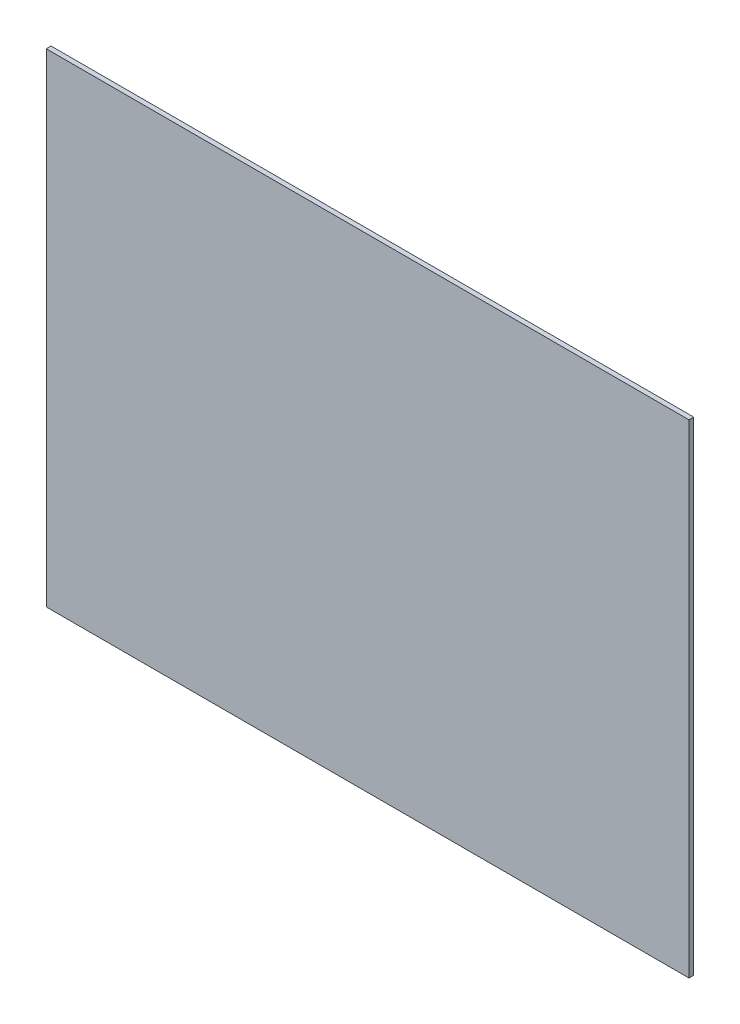
ISO-10303-21;
HEADER;
FILE_DESCRIPTION(('STEP AP214'),'2;1');
FILE_NAME('part.step','',(''),(''),'','','');
FILE_SCHEMA(('AUTOMOTIVE_DESIGN { 1 0 10303 214 1 1 1 1 }'));
ENDSEC;
DATA;
#1=APPLICATION_CONTEXT('core data for automotive mechanical design processes');
#2=APPLICATION_PROTOCOL_DEFINITION('international standard','automotive_design',2000,#1);
#3=PRODUCT_CONTEXT('',#1,'mechanical');
#4=PRODUCT('Part','Part','',(#3));
#5=PRODUCT_RELATED_PRODUCT_CATEGORY('part','',(#4));
#6=PRODUCT_DEFINITION_FORMATION('','',#4);
#7=PRODUCT_DEFINITION_CONTEXT('part definition',#1,'design');
#8=PRODUCT_DEFINITION('design','',#6,#7);
#9=PRODUCT_DEFINITION_SHAPE('','',#8);
#10=(LENGTH_UNIT() NAMED_UNIT(*) SI_UNIT(.MILLI.,.METRE.));
#11=(NAMED_UNIT(*) PLANE_ANGLE_UNIT() SI_UNIT($,.RADIAN.));
#12=(NAMED_UNIT(*) SI_UNIT($,.STERADIAN.) SOLID_ANGLE_UNIT());
#13=UNCERTAINTY_MEASURE_WITH_UNIT(LENGTH_MEASURE(1.E-05),#10,'distance_accuracy_value','');
#14=(GEOMETRIC_REPRESENTATION_CONTEXT(3) GLOBAL_UNCERTAINTY_ASSIGNED_CONTEXT((#13)) GLOBAL_UNIT_ASSIGNED_CONTEXT((#10,
#11,#12)) REPRESENTATION_CONTEXT('',''));
#15=CARTESIAN_POINT('',(0.,0.,0.));
#16=DIRECTION('',(0.,0.,1.));
#17=DIRECTION('',(1.,0.,0.));
#18=AXIS2_PLACEMENT_3D('',#15,#16,#17);
#19=CARTESIAN_POINT('',(403.5,303.5,6.));
#20=DIRECTION('',(-1.,0.,0.));
#21=DIRECTION('',(0.,-1.,0.));
#22=AXIS2_PLACEMENT_3D('',#19,#20,#21);
#23=PLANE('',#22);
#24=DIRECTION('',(0.,1.,0.));
#25=VECTOR('',#24,1.);
#26=CARTESIAN_POINT('',(403.5,303.5,0.));
#27=LINE('',#26,#25);
#28=CARTESIAN_POINT('',(403.5,-303.5,0.));
#29=VERTEX_POINT('',#28);
#30=CARTESIAN_POINT('',(403.5,303.5,0.));
#31=VERTEX_POINT('',#30);
#32=EDGE_CURVE('E98',#29,#31,#27,.T.);
#33=ORIENTED_EDGE('',*,*,#32,.T.);
#34=DIRECTION('',(0.,0.,-1.));
#35=VECTOR('',#34,1.);
#36=CARTESIAN_POINT('',(403.5,303.5,6.));
#37=LINE('',#36,#35);
#38=CARTESIAN_POINT('',(403.5,303.5,6.));
#39=VERTEX_POINT('',#38);
#40=EDGE_CURVE('E11',#39,#31,#37,.T.);
#41=ORIENTED_EDGE('',*,*,#40,.F.);
#42=DIRECTION('',(0.,1.,0.));
#43=VECTOR('',#42,1.);
#44=CARTESIAN_POINT('',(403.5,303.5,6.));
#45=LINE('',#44,#43);
#46=CARTESIAN_POINT('',(403.5,-303.5,6.));
#47=VERTEX_POINT('',#46);
#48=EDGE_CURVE('E86',#47,#39,#45,.T.);
#49=ORIENTED_EDGE('',*,*,#48,.F.);
#50=DIRECTION('',(0.,0.,-1.));
#51=VECTOR('',#50,1.);
#52=CARTESIAN_POINT('',(403.5,-303.5,6.));
#53=LINE('',#52,#51);
#54=EDGE_CURVE('E94',#47,#29,#53,.T.);
#55=ORIENTED_EDGE('',*,*,#54,.T.);
#56=EDGE_LOOP('',(#33,#41,#49,#55));
#57=FACE_BOUND('',#56,.T.);
#58=ADVANCED_FACE('F35',(#57),#23,.F.);
#59=CARTESIAN_POINT('',(-403.5,303.5,6.));
#60=DIRECTION('',(0.,-1.,0.));
#61=DIRECTION('',(0.,0.,-1.));
#62=AXIS2_PLACEMENT_3D('',#59,#60,#61);
#63=PLANE('',#62);
#64=DIRECTION('',(-1.,0.,0.));
#65=VECTOR('',#64,1.);
#66=CARTESIAN_POINT('',(-403.5,303.5,0.));
#67=LINE('',#66,#65);
#68=CARTESIAN_POINT('',(-403.5,303.5,0.));
#69=VERTEX_POINT('',#68);
#70=EDGE_CURVE('E90',#31,#69,#67,.T.);
#71=ORIENTED_EDGE('',*,*,#70,.T.);
#72=DIRECTION('',(0.,0.,-1.));
#73=VECTOR('',#72,1.);
#74=CARTESIAN_POINT('',(-403.5,303.5,6.));
#75=LINE('',#74,#73);
#76=CARTESIAN_POINT('',(-403.5,303.5,6.));
#77=VERTEX_POINT('',#76);
#78=EDGE_CURVE('E43',#77,#69,#75,.T.);
#79=ORIENTED_EDGE('',*,*,#78,.F.);
#80=DIRECTION('',(-1.,0.,0.));
#81=VECTOR('',#80,1.);
#82=CARTESIAN_POINT('',(-403.5,303.5,6.));
#83=LINE('',#82,#81);
#84=EDGE_CURVE('E81',#39,#77,#83,.T.);
#85=ORIENTED_EDGE('',*,*,#84,.F.);
#86=ORIENTED_EDGE('',*,*,#40,.T.);
#87=EDGE_LOOP('',(#71,#79,#85,#86));
#88=FACE_BOUND('',#87,.T.);
#89=ADVANCED_FACE('F89',(#88),#63,.F.);
#90=CARTESIAN_POINT('',(-403.5,303.5,6.));
#91=DIRECTION('',(1.,0.,0.));
#92=DIRECTION('',(0.,0.,-1.));
#93=AXIS2_PLACEMENT_3D('',#90,#91,#92);
#94=PLANE('',#93);
#95=DIRECTION('',(0.,-1.,0.));
#96=VECTOR('',#95,1.);
#97=CARTESIAN_POINT('',(-403.5,303.5,0.));
#98=LINE('',#97,#96);
#99=CARTESIAN_POINT('',(-403.5,-303.5,0.));
#100=VERTEX_POINT('',#99);
#101=EDGE_CURVE('E68',#69,#100,#98,.T.);
#102=ORIENTED_EDGE('',*,*,#101,.T.);
#103=DIRECTION('',(0.,0.,-1.));
#104=VECTOR('',#103,1.);
#105=CARTESIAN_POINT('',(-403.5,-303.5,6.));
#106=LINE('',#105,#104);
#107=CARTESIAN_POINT('',(-403.5,-303.5,6.));
#108=VERTEX_POINT('',#107);
#109=EDGE_CURVE('E91',#108,#100,#106,.T.);
#110=ORIENTED_EDGE('',*,*,#109,.F.);
#111=DIRECTION('',(0.,-1.,0.));
#112=VECTOR('',#111,1.);
#113=CARTESIAN_POINT('',(-403.5,303.5,6.));
#114=LINE('',#113,#112);
#115=EDGE_CURVE('E84',#77,#108,#114,.T.);
#116=ORIENTED_EDGE('',*,*,#115,.F.);
#117=ORIENTED_EDGE('',*,*,#78,.T.);
#118=EDGE_LOOP('',(#102,#110,#116,#117));
#119=FACE_BOUND('',#118,.T.);
#120=ADVANCED_FACE('F92',(#119),#94,.F.);
#121=CARTESIAN_POINT('',(-403.5,-303.5,6.));
#122=DIRECTION('',(0.,1.,0.));
#123=DIRECTION('',(0.,0.,1.));
#124=AXIS2_PLACEMENT_3D('',#121,#122,#123);
#125=PLANE('',#124);
#126=DIRECTION('',(1.,0.,0.));
#127=VECTOR('',#126,1.);
#128=CARTESIAN_POINT('',(-403.5,-303.5,0.));
#129=LINE('',#128,#127);
#130=EDGE_CURVE('E74',#100,#29,#129,.T.);
#131=ORIENTED_EDGE('',*,*,#130,.T.);
#132=ORIENTED_EDGE('',*,*,#54,.F.);
#133=DIRECTION('',(1.,0.,0.));
#134=VECTOR('',#133,1.);
#135=CARTESIAN_POINT('',(-403.5,-303.5,6.));
#136=LINE('',#135,#134);
#137=EDGE_CURVE('E51',#108,#47,#136,.T.);
#138=ORIENTED_EDGE('',*,*,#137,.F.);
#139=ORIENTED_EDGE('',*,*,#109,.T.);
#140=EDGE_LOOP('',(#131,#132,#138,#139));
#141=FACE_BOUND('',#140,.T.);
#142=ADVANCED_FACE('F105',(#141),#125,.F.);
#143=CARTESIAN_POINT('',(0.,0.,6.));
#144=DIRECTION('',(0.,0.,1.));
#145=DIRECTION('',(1.,0.,0.));
#146=AXIS2_PLACEMENT_3D('',#143,#144,#145);
#147=PLANE('',#146);
#148=ORIENTED_EDGE('',*,*,#48,.T.);
#149=ORIENTED_EDGE('',*,*,#84,.T.);
#150=ORIENTED_EDGE('',*,*,#115,.T.);
#151=ORIENTED_EDGE('',*,*,#137,.T.);
#152=EDGE_LOOP('',(#148,#149,#150,#151));
#153=FACE_BOUND('',#152,.T.);
#154=ADVANCED_FACE('F82',(#153),#147,.T.);
#155=CARTESIAN_POINT('',(0.,0.,0.));
#156=DIRECTION('',(0.,0.,1.));
#157=DIRECTION('',(1.,0.,0.));
#158=AXIS2_PLACEMENT_3D('',#155,#156,#157);
#159=PLANE('',#158);
#160=ORIENTED_EDGE('',*,*,#32,.F.);
#161=ORIENTED_EDGE('',*,*,#130,.F.);
#162=ORIENTED_EDGE('',*,*,#101,.F.);
#163=ORIENTED_EDGE('',*,*,#70,.F.);
#164=EDGE_LOOP('',(#160,#161,#162,#163));
#165=FACE_BOUND('',#164,.T.);
#166=ADVANCED_FACE('F108',(#165),#159,.F.);
#167=CLOSED_SHELL('',(#58,#89,#120,#142,#154,#166));
#168=MANIFOLD_SOLID_BREP('B2',#167);
#169=ADVANCED_BREP_SHAPE_REPRESENTATION('',(#18,#168),#14);
#170=SHAPE_DEFINITION_REPRESENTATION(#9,#169);
ENDSEC;
END-ISO-10303-21;
